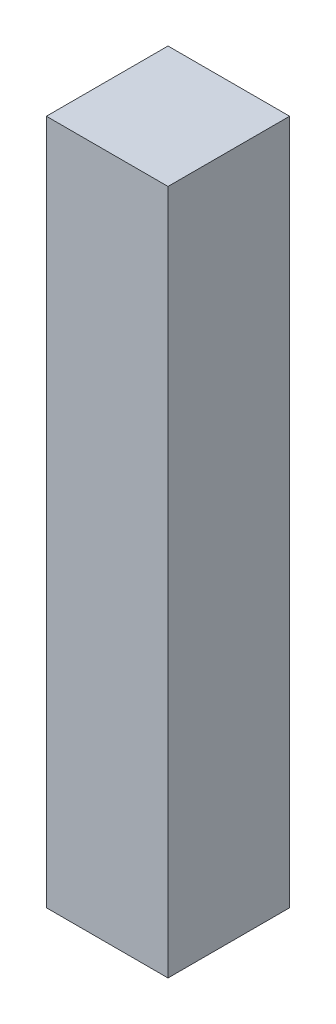
ISO-10303-21;
HEADER;
FILE_DESCRIPTION(('STEP AP214'),'2;1');
FILE_NAME('part.step','',(''),(''),'','','');
FILE_SCHEMA(('AUTOMOTIVE_DESIGN { 1 0 10303 214 1 1 1 1 }'));
ENDSEC;
DATA;
#1=APPLICATION_CONTEXT('core data for automotive mechanical design processes');
#2=APPLICATION_PROTOCOL_DEFINITION('international standard','automotive_design',2000,#1);
#3=PRODUCT_CONTEXT('',#1,'mechanical');
#4=PRODUCT('Part','Part','',(#3));
#5=PRODUCT_RELATED_PRODUCT_CATEGORY('part','',(#4));
#6=PRODUCT_DEFINITION_FORMATION('','',#4);
#7=PRODUCT_DEFINITION_CONTEXT('part definition',#1,'design');
#8=PRODUCT_DEFINITION('design','',#6,#7);
#9=PRODUCT_DEFINITION_SHAPE('','',#8);
#10=(LENGTH_UNIT() NAMED_UNIT(*) SI_UNIT(.MILLI.,.METRE.));
#11=(NAMED_UNIT(*) PLANE_ANGLE_UNIT() SI_UNIT($,.RADIAN.));
#12=(NAMED_UNIT(*) SI_UNIT($,.STERADIAN.) SOLID_ANGLE_UNIT());
#13=UNCERTAINTY_MEASURE_WITH_UNIT(LENGTH_MEASURE(1.E-05),#10,'distance_accuracy_value','');
#14=(GEOMETRIC_REPRESENTATION_CONTEXT(3) GLOBAL_UNCERTAINTY_ASSIGNED_CONTEXT((#13)) GLOBAL_UNIT_ASSIGNED_CONTEXT((#10,
#11,#12)) REPRESENTATION_CONTEXT('',''));
#15=CARTESIAN_POINT('',(0.,0.,0.));
#16=DIRECTION('',(0.,0.,1.));
#17=DIRECTION('',(1.,0.,0.));
#18=AXIS2_PLACEMENT_3D('',#15,#16,#17);
#19=CARTESIAN_POINT('',(-2.75,15.5,5.5));
#20=DIRECTION('',(1.,0.,0.));
#21=DIRECTION('',(0.,1.,0.));
#22=AXIS2_PLACEMENT_3D('',#19,#20,#21);
#23=PLANE('',#22);
#24=DIRECTION('',(0.,-1.,0.));
#25=VECTOR('',#24,1.);
#26=CARTESIAN_POINT('',(-2.75,15.5,0.));
#27=LINE('',#26,#25);
#28=CARTESIAN_POINT('',(-2.75,15.5,0.));
#29=VERTEX_POINT('',#28);
#30=CARTESIAN_POINT('',(-2.75,-15.5,0.));
#31=VERTEX_POINT('',#30);
#32=EDGE_CURVE('E96',#29,#31,#27,.T.);
#33=ORIENTED_EDGE('',*,*,#32,.T.);
#34=DIRECTION('',(0.,0.,-1.));
#35=VECTOR('',#34,1.);
#36=CARTESIAN_POINT('',(-2.75,-15.5,5.5));
#37=LINE('',#36,#35);
#38=CARTESIAN_POINT('',(-2.75,-15.5,5.5));
#39=VERTEX_POINT('',#38);
#40=EDGE_CURVE('E11',#39,#31,#37,.T.);
#41=ORIENTED_EDGE('',*,*,#40,.F.);
#42=DIRECTION('',(0.,-1.,0.));
#43=VECTOR('',#42,1.);
#44=CARTESIAN_POINT('',(-2.75,15.5,5.5));
#45=LINE('',#44,#43);
#46=CARTESIAN_POINT('',(-2.75,15.5,5.5));
#47=VERTEX_POINT('',#46);
#48=EDGE_CURVE('E84',#47,#39,#45,.T.);
#49=ORIENTED_EDGE('',*,*,#48,.F.);
#50=DIRECTION('',(0.,0.,-1.));
#51=VECTOR('',#50,1.);
#52=CARTESIAN_POINT('',(-2.75,15.5,5.5));
#53=LINE('',#52,#51);
#54=EDGE_CURVE('E92',#47,#29,#53,.T.);
#55=ORIENTED_EDGE('',*,*,#54,.T.);
#56=EDGE_LOOP('',(#33,#41,#49,#55));
#57=FACE_BOUND('',#56,.T.);
#58=ADVANCED_FACE('F33',(#57),#23,.F.);
#59=CARTESIAN_POINT('',(2.75,-15.5,5.5));
#60=DIRECTION('',(0.,1.,0.));
#61=DIRECTION('',(-1.,0.,0.));
#62=AXIS2_PLACEMENT_3D('',#59,#60,#61);
#63=PLANE('',#62);
#64=DIRECTION('',(1.,0.,0.));
#65=VECTOR('',#64,1.);
#66=CARTESIAN_POINT('',(2.75,-15.5,0.));
#67=LINE('',#66,#65);
#68=CARTESIAN_POINT('',(2.75,-15.5,0.));
#69=VERTEX_POINT('',#68);
#70=EDGE_CURVE('E88',#31,#69,#67,.T.);
#71=ORIENTED_EDGE('',*,*,#70,.T.);
#72=DIRECTION('',(0.,0.,-1.));
#73=VECTOR('',#72,1.);
#74=CARTESIAN_POINT('',(2.75,-15.5,5.5));
#75=LINE('',#74,#73);
#76=CARTESIAN_POINT('',(2.75,-15.5,5.5));
#77=VERTEX_POINT('',#76);
#78=EDGE_CURVE('E41',#77,#69,#75,.T.);
#79=ORIENTED_EDGE('',*,*,#78,.F.);
#80=DIRECTION('',(1.,0.,0.));
#81=VECTOR('',#80,1.);
#82=CARTESIAN_POINT('',(2.75,-15.5,5.5));
#83=LINE('',#82,#81);
#84=EDGE_CURVE('E79',#39,#77,#83,.T.);
#85=ORIENTED_EDGE('',*,*,#84,.F.);
#86=ORIENTED_EDGE('',*,*,#40,.T.);
#87=EDGE_LOOP('',(#71,#79,#85,#86));
#88=FACE_BOUND('',#87,.T.);
#89=ADVANCED_FACE('F87',(#88),#63,.F.);
#90=CARTESIAN_POINT('',(2.75,15.5,5.5));
#91=DIRECTION('',(-1.,0.,0.));
#92=DIRECTION('',(0.,-1.,0.));
#93=AXIS2_PLACEMENT_3D('',#90,#91,#92);
#94=PLANE('',#93);
#95=DIRECTION('',(0.,1.,0.));
#96=VECTOR('',#95,1.);
#97=CARTESIAN_POINT('',(2.75,15.5,0.));
#98=LINE('',#97,#96);
#99=CARTESIAN_POINT('',(2.75,15.5,0.));
#100=VERTEX_POINT('',#99);
#101=EDGE_CURVE('E66',#69,#100,#98,.T.);
#102=ORIENTED_EDGE('',*,*,#101,.T.);
#103=DIRECTION('',(0.,0.,-1.));
#104=VECTOR('',#103,1.);
#105=CARTESIAN_POINT('',(2.75,15.5,5.5));
#106=LINE('',#105,#104);
#107=CARTESIAN_POINT('',(2.75,15.5,5.5));
#108=VERTEX_POINT('',#107);
#109=EDGE_CURVE('E89',#108,#100,#106,.T.);
#110=ORIENTED_EDGE('',*,*,#109,.F.);
#111=DIRECTION('',(0.,1.,0.));
#112=VECTOR('',#111,1.);
#113=CARTESIAN_POINT('',(2.75,15.5,5.5));
#114=LINE('',#113,#112);
#115=EDGE_CURVE('E82',#77,#108,#114,.T.);
#116=ORIENTED_EDGE('',*,*,#115,.F.);
#117=ORIENTED_EDGE('',*,*,#78,.T.);
#118=EDGE_LOOP('',(#102,#110,#116,#117));
#119=FACE_BOUND('',#118,.T.);
#120=ADVANCED_FACE('F90',(#119),#94,.F.);
#121=CARTESIAN_POINT('',(2.75,15.5,5.5));
#122=DIRECTION('',(0.,-1.,0.));
#123=DIRECTION('',(0.,0.,-1.));
#124=AXIS2_PLACEMENT_3D('',#121,#122,#123);
#125=PLANE('',#124);
#126=DIRECTION('',(-1.,0.,0.));
#127=VECTOR('',#126,1.);
#128=CARTESIAN_POINT('',(2.75,15.5,0.));
#129=LINE('',#128,#127);
#130=EDGE_CURVE('E72',#100,#29,#129,.T.);
#131=ORIENTED_EDGE('',*,*,#130,.T.);
#132=ORIENTED_EDGE('',*,*,#54,.F.);
#133=DIRECTION('',(-1.,0.,0.));
#134=VECTOR('',#133,1.);
#135=CARTESIAN_POINT('',(2.75,15.5,5.5));
#136=LINE('',#135,#134);
#137=EDGE_CURVE('E49',#108,#47,#136,.T.);
#138=ORIENTED_EDGE('',*,*,#137,.F.);
#139=ORIENTED_EDGE('',*,*,#109,.T.);
#140=EDGE_LOOP('',(#131,#132,#138,#139));
#141=FACE_BOUND('',#140,.T.);
#142=ADVANCED_FACE('F103',(#141),#125,.F.);
#143=CARTESIAN_POINT('',(0.,0.,5.5));
#144=DIRECTION('',(0.,0.,-1.));
#145=DIRECTION('',(-1.,0.,0.));
#146=AXIS2_PLACEMENT_3D('',#143,#144,#145);
#147=PLANE('',#146);
#148=ORIENTED_EDGE('',*,*,#48,.T.);
#149=ORIENTED_EDGE('',*,*,#84,.T.);
#150=ORIENTED_EDGE('',*,*,#115,.T.);
#151=ORIENTED_EDGE('',*,*,#137,.T.);
#152=EDGE_LOOP('',(#148,#149,#150,#151));
#153=FACE_BOUND('',#152,.T.);
#154=ADVANCED_FACE('F80',(#153),#147,.F.);
#155=CARTESIAN_POINT('',(0.,0.,0.));
#156=DIRECTION('',(0.,0.,-1.));
#157=DIRECTION('',(-1.,0.,0.));
#158=AXIS2_PLACEMENT_3D('',#155,#156,#157);
#159=PLANE('',#158);
#160=ORIENTED_EDGE('',*,*,#32,.F.);
#161=ORIENTED_EDGE('',*,*,#130,.F.);
#162=ORIENTED_EDGE('',*,*,#101,.F.);
#163=ORIENTED_EDGE('',*,*,#70,.F.);
#164=EDGE_LOOP('',(#160,#161,#162,#163));
#165=FACE_BOUND('',#164,.T.);
#166=ADVANCED_FACE('F106',(#165),#159,.T.);
#167=CLOSED_SHELL('',(#58,#89,#120,#142,#154,#166));
#168=MANIFOLD_SOLID_BREP('B2',#167);
#169=ADVANCED_BREP_SHAPE_REPRESENTATION('',(#18,#168),#14);
#170=SHAPE_DEFINITION_REPRESENTATION(#9,#169);
ENDSEC;
END-ISO-10303-21;
